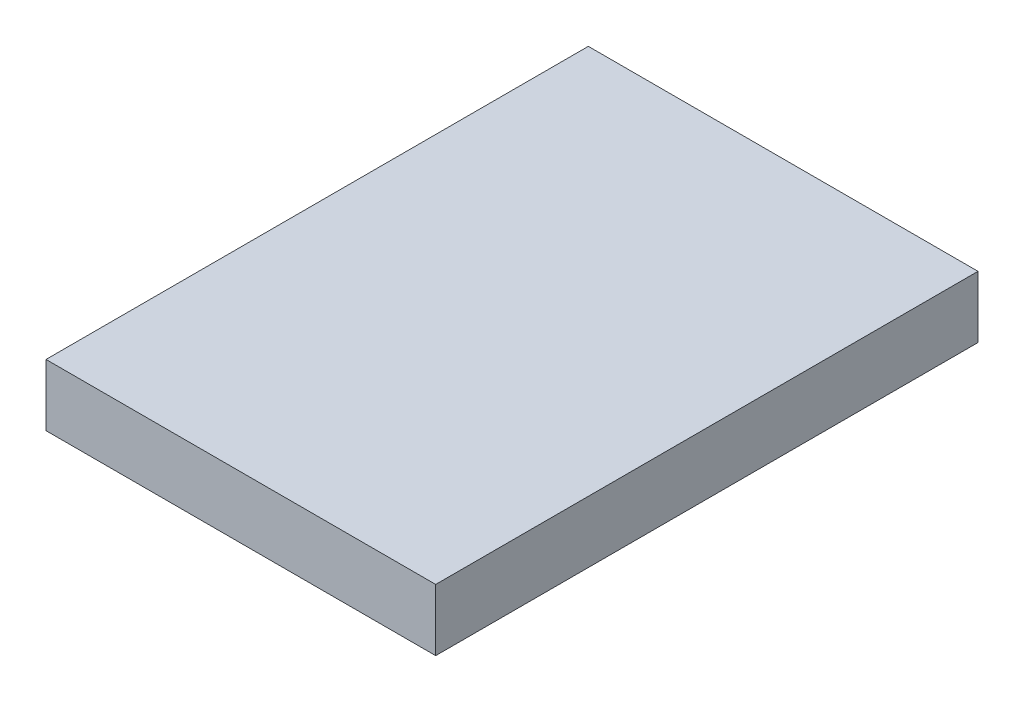
ISO-10303-21;
HEADER;
FILE_DESCRIPTION(('STEP AP214'),'2;1');
FILE_NAME('part.step','',(''),(''),'','','');
FILE_SCHEMA(('AUTOMOTIVE_DESIGN { 1 0 10303 214 1 1 1 1 }'));
ENDSEC;
DATA;
#1=APPLICATION_CONTEXT('core data for automotive mechanical design processes');
#2=APPLICATION_PROTOCOL_DEFINITION('international standard','automotive_design',2000,#1);
#3=PRODUCT_CONTEXT('',#1,'mechanical');
#4=PRODUCT('Part','Part','',(#3));
#5=PRODUCT_RELATED_PRODUCT_CATEGORY('part','',(#4));
#6=PRODUCT_DEFINITION_FORMATION('','',#4);
#7=PRODUCT_DEFINITION_CONTEXT('part definition',#1,'design');
#8=PRODUCT_DEFINITION('design','',#6,#7);
#9=PRODUCT_DEFINITION_SHAPE('','',#8);
#10=(LENGTH_UNIT() NAMED_UNIT(*) SI_UNIT(.MILLI.,.METRE.));
#11=(NAMED_UNIT(*) PLANE_ANGLE_UNIT() SI_UNIT($,.RADIAN.));
#12=(NAMED_UNIT(*) SI_UNIT($,.STERADIAN.) SOLID_ANGLE_UNIT());
#13=UNCERTAINTY_MEASURE_WITH_UNIT(LENGTH_MEASURE(1.E-05),#10,'distance_accuracy_value','');
#14=(GEOMETRIC_REPRESENTATION_CONTEXT(3) GLOBAL_UNCERTAINTY_ASSIGNED_CONTEXT((#13)) GLOBAL_UNIT_ASSIGNED_CONTEXT((#10,
#11,#12)) REPRESENTATION_CONTEXT('',''));
#15=CARTESIAN_POINT('',(0.,0.,0.));
#16=DIRECTION('',(0.,0.,1.));
#17=DIRECTION('',(1.,0.,0.));
#18=AXIS2_PLACEMENT_3D('',#15,#16,#17);
#19=CARTESIAN_POINT('',(0.,9.5,0.));
#20=DIRECTION('',(1.,0.,0.));
#21=DIRECTION('',(0.,0.,-1.));
#22=AXIS2_PLACEMENT_3D('',#19,#20,#21);
#23=PLANE('',#22);
#24=DIRECTION('',(0.,0.,1.));
#25=VECTOR('',#24,1.);
#26=CARTESIAN_POINT('',(0.,0.,0.));
#27=LINE('',#26,#25);
#28=CARTESIAN_POINT('',(0.,0.,0.));
#29=VERTEX_POINT('',#28);
#30=CARTESIAN_POINT('',(0.,0.,83.5));
#31=VERTEX_POINT('',#30);
#32=EDGE_CURVE('E98',#29,#31,#27,.T.);
#33=ORIENTED_EDGE('',*,*,#32,.T.);
#34=DIRECTION('',(0.,-1.,0.));
#35=VECTOR('',#34,1.);
#36=CARTESIAN_POINT('',(0.,9.5,83.5));
#37=LINE('',#36,#35);
#38=CARTESIAN_POINT('',(0.,9.5,83.5));
#39=VERTEX_POINT('',#38);
#40=EDGE_CURVE('E11',#39,#31,#37,.T.);
#41=ORIENTED_EDGE('',*,*,#40,.F.);
#42=DIRECTION('',(0.,0.,1.));
#43=VECTOR('',#42,1.);
#44=CARTESIAN_POINT('',(0.,9.5,0.));
#45=LINE('',#44,#43);
#46=CARTESIAN_POINT('',(0.,9.5,0.));
#47=VERTEX_POINT('',#46);
#48=EDGE_CURVE('E86',#47,#39,#45,.T.);
#49=ORIENTED_EDGE('',*,*,#48,.F.);
#50=DIRECTION('',(0.,-1.,0.));
#51=VECTOR('',#50,1.);
#52=CARTESIAN_POINT('',(0.,9.5,0.));
#53=LINE('',#52,#51);
#54=EDGE_CURVE('E94',#47,#29,#53,.T.);
#55=ORIENTED_EDGE('',*,*,#54,.T.);
#56=EDGE_LOOP('',(#33,#41,#49,#55));
#57=FACE_BOUND('',#56,.T.);
#58=ADVANCED_FACE('F35',(#57),#23,.F.);
#59=CARTESIAN_POINT('',(0.,9.5,83.5));
#60=DIRECTION('',(0.,0.,-1.));
#61=DIRECTION('',(-1.,0.,0.));
#62=AXIS2_PLACEMENT_3D('',#59,#60,#61);
#63=PLANE('',#62);
#64=DIRECTION('',(1.,0.,0.));
#65=VECTOR('',#64,1.);
#66=CARTESIAN_POINT('',(0.,0.,83.5));
#67=LINE('',#66,#65);
#68=CARTESIAN_POINT('',(60.,0.,83.5));
#69=VERTEX_POINT('',#68);
#70=EDGE_CURVE('E90',#31,#69,#67,.T.);
#71=ORIENTED_EDGE('',*,*,#70,.T.);
#72=DIRECTION('',(0.,-1.,0.));
#73=VECTOR('',#72,1.);
#74=CARTESIAN_POINT('',(60.,9.5,83.5));
#75=LINE('',#74,#73);
#76=CARTESIAN_POINT('',(60.,9.5,83.5));
#77=VERTEX_POINT('',#76);
#78=EDGE_CURVE('E43',#77,#69,#75,.T.);
#79=ORIENTED_EDGE('',*,*,#78,.F.);
#80=DIRECTION('',(1.,0.,0.));
#81=VECTOR('',#80,1.);
#82=CARTESIAN_POINT('',(0.,9.5,83.5));
#83=LINE('',#82,#81);
#84=EDGE_CURVE('E81',#39,#77,#83,.T.);
#85=ORIENTED_EDGE('',*,*,#84,.F.);
#86=ORIENTED_EDGE('',*,*,#40,.T.);
#87=EDGE_LOOP('',(#71,#79,#85,#86));
#88=FACE_BOUND('',#87,.T.);
#89=ADVANCED_FACE('F89',(#88),#63,.F.);
#90=CARTESIAN_POINT('',(60.,9.5,0.));
#91=DIRECTION('',(-1.,0.,0.));
#92=DIRECTION('',(0.,0.,1.));
#93=AXIS2_PLACEMENT_3D('',#90,#91,#92);
#94=PLANE('',#93);
#95=DIRECTION('',(0.,0.,-1.));
#96=VECTOR('',#95,1.);
#97=CARTESIAN_POINT('',(60.,0.,0.));
#98=LINE('',#97,#96);
#99=CARTESIAN_POINT('',(60.,0.,0.));
#100=VERTEX_POINT('',#99);
#101=EDGE_CURVE('E68',#69,#100,#98,.T.);
#102=ORIENTED_EDGE('',*,*,#101,.T.);
#103=DIRECTION('',(0.,-1.,0.));
#104=VECTOR('',#103,1.);
#105=CARTESIAN_POINT('',(60.,9.5,0.));
#106=LINE('',#105,#104);
#107=CARTESIAN_POINT('',(60.,9.5,0.));
#108=VERTEX_POINT('',#107);
#109=EDGE_CURVE('E91',#108,#100,#106,.T.);
#110=ORIENTED_EDGE('',*,*,#109,.F.);
#111=DIRECTION('',(0.,0.,-1.));
#112=VECTOR('',#111,1.);
#113=CARTESIAN_POINT('',(60.,9.5,0.));
#114=LINE('',#113,#112);
#115=EDGE_CURVE('E84',#77,#108,#114,.T.);
#116=ORIENTED_EDGE('',*,*,#115,.F.);
#117=ORIENTED_EDGE('',*,*,#78,.T.);
#118=EDGE_LOOP('',(#102,#110,#116,#117));
#119=FACE_BOUND('',#118,.T.);
#120=ADVANCED_FACE('F92',(#119),#94,.F.);
#121=CARTESIAN_POINT('',(0.,9.5,0.));
#122=DIRECTION('',(0.,0.,1.));
#123=DIRECTION('',(1.,0.,0.));
#124=AXIS2_PLACEMENT_3D('',#121,#122,#123);
#125=PLANE('',#124);
#126=DIRECTION('',(-1.,0.,0.));
#127=VECTOR('',#126,1.);
#128=CARTESIAN_POINT('',(0.,0.,0.));
#129=LINE('',#128,#127);
#130=EDGE_CURVE('E74',#100,#29,#129,.T.);
#131=ORIENTED_EDGE('',*,*,#130,.T.);
#132=ORIENTED_EDGE('',*,*,#54,.F.);
#133=DIRECTION('',(-1.,0.,0.));
#134=VECTOR('',#133,1.);
#135=CARTESIAN_POINT('',(0.,9.5,0.));
#136=LINE('',#135,#134);
#137=EDGE_CURVE('E51',#108,#47,#136,.T.);
#138=ORIENTED_EDGE('',*,*,#137,.F.);
#139=ORIENTED_EDGE('',*,*,#109,.T.);
#140=EDGE_LOOP('',(#131,#132,#138,#139));
#141=FACE_BOUND('',#140,.T.);
#142=ADVANCED_FACE('F105',(#141),#125,.F.);
#143=CARTESIAN_POINT('',(0.,9.5,0.));
#144=DIRECTION('',(0.,1.,0.));
#145=DIRECTION('',(0.,0.,1.));
#146=AXIS2_PLACEMENT_3D('',#143,#144,#145);
#147=PLANE('',#146);
#148=ORIENTED_EDGE('',*,*,#48,.T.);
#149=ORIENTED_EDGE('',*,*,#84,.T.);
#150=ORIENTED_EDGE('',*,*,#115,.T.);
#151=ORIENTED_EDGE('',*,*,#137,.T.);
#152=EDGE_LOOP('',(#148,#149,#150,#151));
#153=FACE_BOUND('',#152,.T.);
#154=ADVANCED_FACE('F82',(#153),#147,.T.);
#155=CARTESIAN_POINT('',(0.,0.,0.));
#156=DIRECTION('',(0.,1.,0.));
#157=DIRECTION('',(0.,0.,1.));
#158=AXIS2_PLACEMENT_3D('',#155,#156,#157);
#159=PLANE('',#158);
#160=ORIENTED_EDGE('',*,*,#32,.F.);
#161=ORIENTED_EDGE('',*,*,#130,.F.);
#162=ORIENTED_EDGE('',*,*,#101,.F.);
#163=ORIENTED_EDGE('',*,*,#70,.F.);
#164=EDGE_LOOP('',(#160,#161,#162,#163));
#165=FACE_BOUND('',#164,.T.);
#166=ADVANCED_FACE('F108',(#165),#159,.F.);
#167=CLOSED_SHELL('',(#58,#89,#120,#142,#154,#166));
#168=MANIFOLD_SOLID_BREP('B2',#167);
#169=ADVANCED_BREP_SHAPE_REPRESENTATION('',(#18,#168),#14);
#170=SHAPE_DEFINITION_REPRESENTATION(#9,#169);
ENDSEC;
END-ISO-10303-21;
